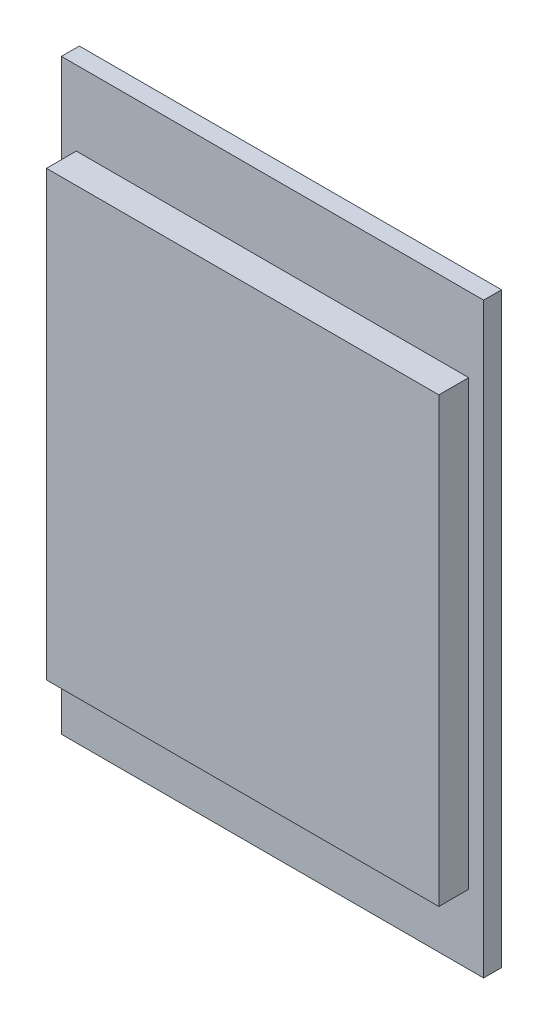
ISO-10303-21;
HEADER;
FILE_DESCRIPTION(('STEP AP214'),'2;1');
FILE_NAME('part.step','',(''),(''),'','','');
FILE_SCHEMA(('AUTOMOTIVE_DESIGN { 1 0 10303 214 1 1 1 1 }'));
ENDSEC;
DATA;
#1=APPLICATION_CONTEXT('core data for automotive mechanical design processes');
#2=APPLICATION_PROTOCOL_DEFINITION('international standard','automotive_design',2000,#1);
#3=PRODUCT_CONTEXT('',#1,'mechanical');
#4=PRODUCT('Part','Part','',(#3));
#5=PRODUCT_RELATED_PRODUCT_CATEGORY('part','',(#4));
#6=PRODUCT_DEFINITION_FORMATION('','',#4);
#7=PRODUCT_DEFINITION_CONTEXT('part definition',#1,'design');
#8=PRODUCT_DEFINITION('design','',#6,#7);
#9=PRODUCT_DEFINITION_SHAPE('','',#8);
#10=(LENGTH_UNIT() NAMED_UNIT(*) SI_UNIT(.MILLI.,.METRE.));
#11=(NAMED_UNIT(*) PLANE_ANGLE_UNIT() SI_UNIT($,.RADIAN.));
#12=(NAMED_UNIT(*) SI_UNIT($,.STERADIAN.) SOLID_ANGLE_UNIT());
#13=UNCERTAINTY_MEASURE_WITH_UNIT(LENGTH_MEASURE(1.E-05),#10,'distance_accuracy_value','');
#14=(GEOMETRIC_REPRESENTATION_CONTEXT(3) GLOBAL_UNCERTAINTY_ASSIGNED_CONTEXT((#13)) GLOBAL_UNIT_ASSIGNED_CONTEXT((#10,
#11,#12)) REPRESENTATION_CONTEXT('',''));
#15=CARTESIAN_POINT('',(0.,0.,0.));
#16=DIRECTION('',(0.,0.,1.));
#17=DIRECTION('',(1.,0.,0.));
#18=AXIS2_PLACEMENT_3D('',#15,#16,#17);
#19=CARTESIAN_POINT('',(14.15,19.675,1.2));
#20=DIRECTION('',(-1.,0.,0.));
#21=DIRECTION('',(0.,-1.,0.));
#22=AXIS2_PLACEMENT_3D('',#19,#20,#21);
#23=PLANE('',#22);
#24=DIRECTION('',(0.,1.,0.));
#25=VECTOR('',#24,1.);
#26=CARTESIAN_POINT('',(14.15,19.675,0.));
#27=LINE('',#26,#25);
#28=CARTESIAN_POINT('',(14.15,-19.675,0.));
#29=VERTEX_POINT('',#28);
#30=CARTESIAN_POINT('',(14.15,19.675,0.));
#31=VERTEX_POINT('',#30);
#32=EDGE_CURVE('E124',#29,#31,#27,.T.);
#33=ORIENTED_EDGE('',*,*,#32,.T.);
#34=DIRECTION('',(0.,0.,-1.));
#35=VECTOR('',#34,1.);
#36=CARTESIAN_POINT('',(14.15,19.675,1.2));
#37=LINE('',#36,#35);
#38=CARTESIAN_POINT('',(14.15,19.675,1.2));
#39=VERTEX_POINT('',#38);
#40=EDGE_CURVE('E11',#39,#31,#37,.T.);
#41=ORIENTED_EDGE('',*,*,#40,.F.);
#42=DIRECTION('',(0.,1.,0.));
#43=VECTOR('',#42,1.);
#44=CARTESIAN_POINT('',(14.15,19.675,1.2));
#45=LINE('',#44,#43);
#46=CARTESIAN_POINT('',(14.15,-19.675,1.2));
#47=VERTEX_POINT('',#46);
#48=EDGE_CURVE('E132',#47,#39,#45,.T.);
#49=ORIENTED_EDGE('',*,*,#48,.F.);
#50=DIRECTION('',(0.,0.,-1.));
#51=VECTOR('',#50,1.);
#52=CARTESIAN_POINT('',(14.15,-19.675,1.2));
#53=LINE('',#52,#51);
#54=EDGE_CURVE('E142',#47,#29,#53,.T.);
#55=ORIENTED_EDGE('',*,*,#54,.T.);
#56=EDGE_LOOP('',(#33,#41,#49,#55));
#57=FACE_BOUND('',#56,.T.);
#58=ADVANCED_FACE('F41',(#57),#23,.F.);
#59=CARTESIAN_POINT('',(-14.15,19.675,1.2));
#60=DIRECTION('',(0.,-1.,0.));
#61=DIRECTION('',(0.,0.,-1.));
#62=AXIS2_PLACEMENT_3D('',#59,#60,#61);
#63=PLANE('',#62);
#64=DIRECTION('',(-1.,0.,0.));
#65=VECTOR('',#64,1.);
#66=CARTESIAN_POINT('',(-14.15,19.675,0.));
#67=LINE('',#66,#65);
#68=CARTESIAN_POINT('',(-14.15,19.675,0.));
#69=VERTEX_POINT('',#68);
#70=EDGE_CURVE('E126',#31,#69,#67,.T.);
#71=ORIENTED_EDGE('',*,*,#70,.T.);
#72=DIRECTION('',(0.,0.,-1.));
#73=VECTOR('',#72,1.);
#74=CARTESIAN_POINT('',(-14.15,19.675,1.2));
#75=LINE('',#74,#73);
#76=CARTESIAN_POINT('',(-14.15,19.675,1.2));
#77=VERTEX_POINT('',#76);
#78=EDGE_CURVE('E48',#77,#69,#75,.T.);
#79=ORIENTED_EDGE('',*,*,#78,.F.);
#80=DIRECTION('',(-1.,0.,0.));
#81=VECTOR('',#80,1.);
#82=CARTESIAN_POINT('',(-14.15,19.675,1.2));
#83=LINE('',#82,#81);
#84=EDGE_CURVE('E140',#39,#77,#83,.T.);
#85=ORIENTED_EDGE('',*,*,#84,.F.);
#86=ORIENTED_EDGE('',*,*,#40,.T.);
#87=EDGE_LOOP('',(#71,#79,#85,#86));
#88=FACE_BOUND('',#87,.T.);
#89=ADVANCED_FACE('F174',(#88),#63,.F.);
#90=CARTESIAN_POINT('',(-14.15,19.675,1.2));
#91=DIRECTION('',(1.,0.,0.));
#92=DIRECTION('',(0.,1.,0.));
#93=AXIS2_PLACEMENT_3D('',#90,#91,#92);
#94=PLANE('',#93);
#95=DIRECTION('',(0.,-1.,0.));
#96=VECTOR('',#95,1.);
#97=CARTESIAN_POINT('',(-14.15,19.675,0.));
#98=LINE('',#97,#96);
#99=CARTESIAN_POINT('',(-14.15,-19.675,0.));
#100=VERTEX_POINT('',#99);
#101=EDGE_CURVE('E147',#69,#100,#98,.T.);
#102=ORIENTED_EDGE('',*,*,#101,.T.);
#103=DIRECTION('',(0.,0.,-1.));
#104=VECTOR('',#103,1.);
#105=CARTESIAN_POINT('',(-14.15,-19.675,1.2));
#106=LINE('',#105,#104);
#107=CARTESIAN_POINT('',(-14.15,-19.675,1.2));
#108=VERTEX_POINT('',#107);
#109=EDGE_CURVE('E152',#108,#100,#106,.T.);
#110=ORIENTED_EDGE('',*,*,#109,.F.);
#111=DIRECTION('',(0.,-1.,0.));
#112=VECTOR('',#111,1.);
#113=CARTESIAN_POINT('',(-14.15,19.675,1.2));
#114=LINE('',#113,#112);
#115=EDGE_CURVE('E139',#77,#108,#114,.T.);
#116=ORIENTED_EDGE('',*,*,#115,.F.);
#117=ORIENTED_EDGE('',*,*,#78,.T.);
#118=EDGE_LOOP('',(#102,#110,#116,#117));
#119=FACE_BOUND('',#118,.T.);
#120=ADVANCED_FACE('F156',(#119),#94,.F.);
#121=CARTESIAN_POINT('',(-14.15,-19.675,1.2));
#122=DIRECTION('',(0.,1.,0.));
#123=DIRECTION('',(0.,0.,1.));
#124=AXIS2_PLACEMENT_3D('',#121,#122,#123);
#125=PLANE('',#124);
#126=DIRECTION('',(1.,0.,0.));
#127=VECTOR('',#126,1.);
#128=CARTESIAN_POINT('',(-14.15,-19.675,0.));
#129=LINE('',#128,#127);
#130=EDGE_CURVE('E138',#100,#29,#129,.T.);
#131=ORIENTED_EDGE('',*,*,#130,.T.);
#132=ORIENTED_EDGE('',*,*,#54,.F.);
#133=DIRECTION('',(1.,0.,0.));
#134=VECTOR('',#133,1.);
#135=CARTESIAN_POINT('',(-14.15,-19.675,1.2));
#136=LINE('',#135,#134);
#137=EDGE_CURVE('E145',#108,#47,#136,.T.);
#138=ORIENTED_EDGE('',*,*,#137,.F.);
#139=ORIENTED_EDGE('',*,*,#109,.T.);
#140=EDGE_LOOP('',(#131,#132,#138,#139));
#141=FACE_BOUND('',#140,.T.);
#142=ADVANCED_FACE('F167',(#141),#125,.F.);
#143=CARTESIAN_POINT('',(0.,0.,1.2));
#144=DIRECTION('',(0.,0.,1.));
#145=DIRECTION('',(1.,0.,0.));
#146=AXIS2_PLACEMENT_3D('',#143,#144,#145);
#147=PLANE('',#146);
#148=DIRECTION('',(0.,1.,0.));
#149=VECTOR('',#148,1.);
#150=CARTESIAN_POINT('',(13.15,14.675,1.2));
#151=LINE('',#150,#149);
#152=CARTESIAN_POINT('',(13.15,-15.025,1.2));
#153=VERTEX_POINT('',#152);
#154=CARTESIAN_POINT('',(13.15,14.675,1.2));
#155=VERTEX_POINT('',#154);
#156=EDGE_CURVE('E54',#153,#155,#151,.T.);
#157=ORIENTED_EDGE('',*,*,#156,.F.);
#158=DIRECTION('',(1.,0.,0.));
#159=VECTOR('',#158,1.);
#160=CARTESIAN_POINT('',(-13.15,-15.025,1.2));
#161=LINE('',#160,#159);
#162=CARTESIAN_POINT('',(-13.15,-15.025,1.2));
#163=VERTEX_POINT('',#162);
#164=EDGE_CURVE('E56',#163,#153,#161,.T.);
#165=ORIENTED_EDGE('',*,*,#164,.F.);
#166=DIRECTION('',(0.,-1.,0.));
#167=VECTOR('',#166,1.);
#168=CARTESIAN_POINT('',(-13.15,14.675,1.2));
#169=LINE('',#168,#167);
#170=CARTESIAN_POINT('',(-13.15,14.675,1.2));
#171=VERTEX_POINT('',#170);
#172=EDGE_CURVE('E269',#171,#163,#169,.T.);
#173=ORIENTED_EDGE('',*,*,#172,.F.);
#174=DIRECTION('',(-1.,0.,0.));
#175=VECTOR('',#174,1.);
#176=CARTESIAN_POINT('',(-13.15,14.675,1.2));
#177=LINE('',#176,#175);
#178=EDGE_CURVE('E276',#155,#171,#177,.T.);
#179=ORIENTED_EDGE('',*,*,#178,.F.);
#180=EDGE_LOOP('',(#157,#165,#173,#179));
#181=FACE_BOUND('',#180,.T.);
#182=ORIENTED_EDGE('',*,*,#48,.T.);
#183=ORIENTED_EDGE('',*,*,#84,.T.);
#184=ORIENTED_EDGE('',*,*,#115,.T.);
#185=ORIENTED_EDGE('',*,*,#137,.T.);
#186=EDGE_LOOP('',(#182,#183,#184,#185));
#187=FACE_BOUND('',#186,.T.);
#188=ADVANCED_FACE('F171',(#181,#187),#147,.T.);
#189=CARTESIAN_POINT('',(0.,0.,0.));
#190=DIRECTION('',(0.,0.,1.));
#191=DIRECTION('',(1.,0.,0.));
#192=AXIS2_PLACEMENT_3D('',#189,#190,#191);
#193=PLANE('',#192);
#194=ORIENTED_EDGE('',*,*,#32,.F.);
#195=ORIENTED_EDGE('',*,*,#130,.F.);
#196=ORIENTED_EDGE('',*,*,#101,.F.);
#197=ORIENTED_EDGE('',*,*,#70,.F.);
#198=EDGE_LOOP('',(#194,#195,#196,#197));
#199=FACE_BOUND('',#198,.T.);
#200=ADVANCED_FACE('F161',(#199),#193,.F.);
#201=CARTESIAN_POINT('',(13.15,14.675,3.2));
#202=DIRECTION('',(-1.,0.,0.));
#203=DIRECTION('',(0.,-1.,0.));
#204=AXIS2_PLACEMENT_3D('',#201,#202,#203);
#205=PLANE('',#204);
#206=ORIENTED_EDGE('',*,*,#156,.T.);
#207=DIRECTION('',(0.,0.,-1.));
#208=VECTOR('',#207,1.);
#209=CARTESIAN_POINT('',(13.15,14.675,3.2));
#210=LINE('',#209,#208);
#211=CARTESIAN_POINT('',(13.15,14.675,3.2));
#212=VERTEX_POINT('',#211);
#213=EDGE_CURVE('E110',#212,#155,#210,.T.);
#214=ORIENTED_EDGE('',*,*,#213,.F.);
#215=DIRECTION('',(0.,1.,0.));
#216=VECTOR('',#215,1.);
#217=CARTESIAN_POINT('',(13.15,14.675,3.2));
#218=LINE('',#217,#216);
#219=CARTESIAN_POINT('',(13.15,-15.025,3.2));
#220=VERTEX_POINT('',#219);
#221=EDGE_CURVE('E114',#220,#212,#218,.T.);
#222=ORIENTED_EDGE('',*,*,#221,.F.);
#223=DIRECTION('',(0.,0.,-1.));
#224=VECTOR('',#223,1.);
#225=CARTESIAN_POINT('',(13.15,-15.025,3.2));
#226=LINE('',#225,#224);
#227=EDGE_CURVE('E268',#220,#153,#226,.T.);
#228=ORIENTED_EDGE('',*,*,#227,.T.);
#229=EDGE_LOOP('',(#206,#214,#222,#228));
#230=FACE_BOUND('',#229,.T.);
#231=ADVANCED_FACE('F125',(#230),#205,.F.);
#232=CARTESIAN_POINT('',(-13.15,14.675,3.2));
#233=DIRECTION('',(0.,-1.,0.));
#234=DIRECTION('',(0.,0.,-1.));
#235=AXIS2_PLACEMENT_3D('',#232,#233,#234);
#236=PLANE('',#235);
#237=ORIENTED_EDGE('',*,*,#178,.T.);
#238=DIRECTION('',(0.,0.,-1.));
#239=VECTOR('',#238,1.);
#240=CARTESIAN_POINT('',(-13.15,14.675,3.2));
#241=LINE('',#240,#239);
#242=CARTESIAN_POINT('',(-13.15,14.675,3.2));
#243=VERTEX_POINT('',#242);
#244=EDGE_CURVE('E108',#243,#171,#241,.T.);
#245=ORIENTED_EDGE('',*,*,#244,.F.);
#246=DIRECTION('',(-1.,0.,0.));
#247=VECTOR('',#246,1.);
#248=CARTESIAN_POINT('',(-13.15,14.675,3.2));
#249=LINE('',#248,#247);
#250=EDGE_CURVE('E104',#212,#243,#249,.T.);
#251=ORIENTED_EDGE('',*,*,#250,.F.);
#252=ORIENTED_EDGE('',*,*,#213,.T.);
#253=EDGE_LOOP('',(#237,#245,#251,#252));
#254=FACE_BOUND('',#253,.T.);
#255=ADVANCED_FACE('F107',(#254),#236,.F.);
#256=CARTESIAN_POINT('',(-13.15,14.675,3.2));
#257=DIRECTION('',(1.,0.,0.));
#258=DIRECTION('',(0.,1.,0.));
#259=AXIS2_PLACEMENT_3D('',#256,#257,#258);
#260=PLANE('',#259);
#261=ORIENTED_EDGE('',*,*,#172,.T.);
#262=DIRECTION('',(0.,0.,-1.));
#263=VECTOR('',#262,1.);
#264=CARTESIAN_POINT('',(-13.15,-15.025,3.2));
#265=LINE('',#264,#263);
#266=CARTESIAN_POINT('',(-13.15,-15.025,3.2));
#267=VERTEX_POINT('',#266);
#268=EDGE_CURVE('E127',#267,#163,#265,.T.);
#269=ORIENTED_EDGE('',*,*,#268,.F.);
#270=DIRECTION('',(0.,-1.,0.));
#271=VECTOR('',#270,1.);
#272=CARTESIAN_POINT('',(-13.15,14.675,3.2));
#273=LINE('',#272,#271);
#274=EDGE_CURVE('E111',#243,#267,#273,.T.);
#275=ORIENTED_EDGE('',*,*,#274,.F.);
#276=ORIENTED_EDGE('',*,*,#244,.T.);
#277=EDGE_LOOP('',(#261,#269,#275,#276));
#278=FACE_BOUND('',#277,.T.);
#279=ADVANCED_FACE('F195',(#278),#260,.F.);
#280=CARTESIAN_POINT('',(-13.15,-15.025,3.2));
#281=DIRECTION('',(0.,1.,0.));
#282=DIRECTION('',(0.,0.,1.));
#283=AXIS2_PLACEMENT_3D('',#280,#281,#282);
#284=PLANE('',#283);
#285=ORIENTED_EDGE('',*,*,#164,.T.);
#286=ORIENTED_EDGE('',*,*,#227,.F.);
#287=DIRECTION('',(1.,0.,0.));
#288=VECTOR('',#287,1.);
#289=CARTESIAN_POINT('',(-13.15,-15.025,3.2));
#290=LINE('',#289,#288);
#291=EDGE_CURVE('E116',#267,#220,#290,.T.);
#292=ORIENTED_EDGE('',*,*,#291,.F.);
#293=ORIENTED_EDGE('',*,*,#268,.T.);
#294=EDGE_LOOP('',(#285,#286,#292,#293));
#295=FACE_BOUND('',#294,.T.);
#296=ADVANCED_FACE('F193',(#295),#284,.F.);
#297=CARTESIAN_POINT('',(0.,0.,3.2));
#298=DIRECTION('',(0.,0.,1.));
#299=DIRECTION('',(1.,0.,0.));
#300=AXIS2_PLACEMENT_3D('',#297,#298,#299);
#301=PLANE('',#300);
#302=ORIENTED_EDGE('',*,*,#221,.T.);
#303=ORIENTED_EDGE('',*,*,#250,.T.);
#304=ORIENTED_EDGE('',*,*,#274,.T.);
#305=ORIENTED_EDGE('',*,*,#291,.T.);
#306=EDGE_LOOP('',(#302,#303,#304,#305));
#307=FACE_BOUND('',#306,.T.);
#308=ADVANCED_FACE('F119',(#307),#301,.T.);
#309=CLOSED_SHELL('',(#58,#89,#120,#142,#188,#200,#231,#255,#279,#296,#308));
#310=MANIFOLD_SOLID_BREP('B2',#309);
#311=ADVANCED_BREP_SHAPE_REPRESENTATION('',(#18,#310),#14);
#312=SHAPE_DEFINITION_REPRESENTATION(#9,#311);
ENDSEC;
END-ISO-10303-21;
